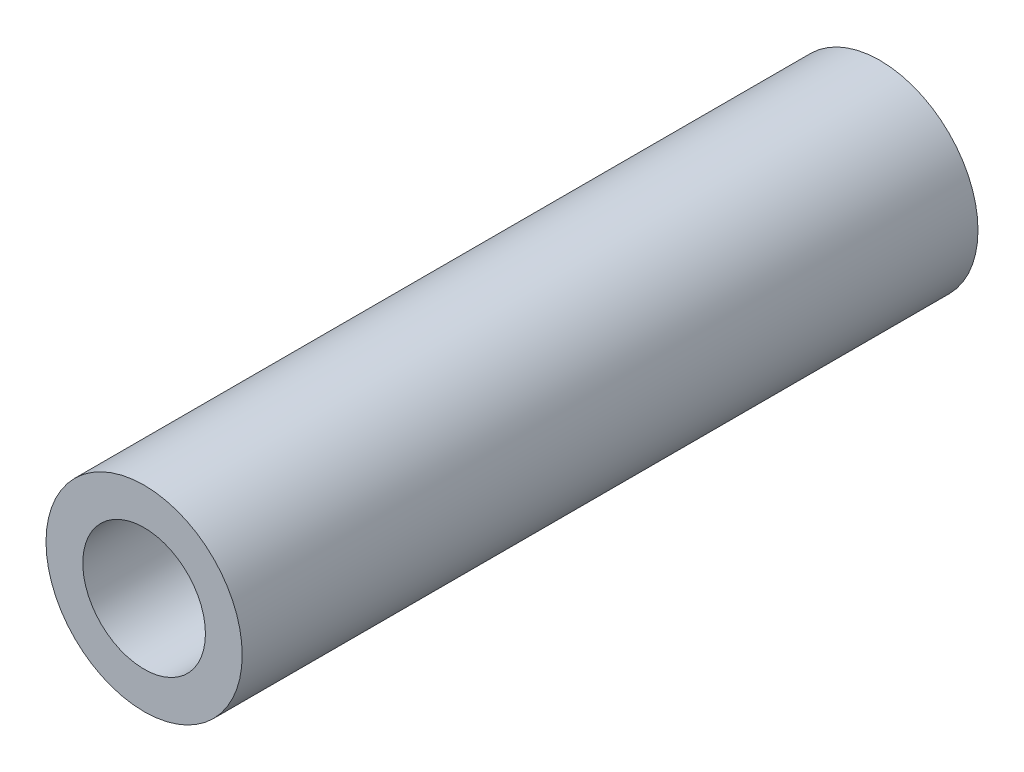
ISO-10303-21;
HEADER;
FILE_DESCRIPTION(('STEP AP214'),'2;1');
FILE_NAME('part.step','',(''),(''),'','','');
FILE_SCHEMA(('AUTOMOTIVE_DESIGN { 1 0 10303 214 1 1 1 1 }'));
ENDSEC;
DATA;
#1=APPLICATION_CONTEXT('core data for automotive mechanical design processes');
#2=APPLICATION_PROTOCOL_DEFINITION('international standard','automotive_design',2000,#1);
#3=PRODUCT_CONTEXT('',#1,'mechanical');
#4=PRODUCT('Part','Part','',(#3));
#5=PRODUCT_RELATED_PRODUCT_CATEGORY('part','',(#4));
#6=PRODUCT_DEFINITION_FORMATION('','',#4);
#7=PRODUCT_DEFINITION_CONTEXT('part definition',#1,'design');
#8=PRODUCT_DEFINITION('design','',#6,#7);
#9=PRODUCT_DEFINITION_SHAPE('','',#8);
#10=(LENGTH_UNIT() NAMED_UNIT(*) SI_UNIT(.MILLI.,.METRE.));
#11=(NAMED_UNIT(*) PLANE_ANGLE_UNIT() SI_UNIT($,.RADIAN.));
#12=(NAMED_UNIT(*) SI_UNIT($,.STERADIAN.) SOLID_ANGLE_UNIT());
#13=UNCERTAINTY_MEASURE_WITH_UNIT(LENGTH_MEASURE(1.E-05),#10,'distance_accuracy_value','');
#14=(GEOMETRIC_REPRESENTATION_CONTEXT(3) GLOBAL_UNCERTAINTY_ASSIGNED_CONTEXT((#13)) GLOBAL_UNIT_ASSIGNED_CONTEXT((#10,
#11,#12)) REPRESENTATION_CONTEXT('',''));
#15=CARTESIAN_POINT('',(0.,0.,0.));
#16=DIRECTION('',(0.,0.,1.));
#17=DIRECTION('',(1.,0.,0.));
#18=AXIS2_PLACEMENT_3D('',#15,#16,#17);
#19=CARTESIAN_POINT('',(0.,0.,15.));
#20=DIRECTION('',(0.,0.,1.));
#21=DIRECTION('',(1.,0.,0.));
#22=AXIS2_PLACEMENT_3D('',#19,#20,#21);
#23=PLANE('',#22);
#24=CARTESIAN_POINT('',(0.,0.,15.));
#25=DIRECTION('',(0.,0.,1.));
#26=DIRECTION('',(1.,0.,0.));
#27=AXIS2_PLACEMENT_3D('',#24,#25,#26);
#28=CIRCLE('',#27,4.);
#29=CARTESIAN_POINT('',(4.,0.,15.));
#30=VERTEX_POINT('',#29);
#31=EDGE_CURVE('E10',#30,#30,#28,.T.);
#32=ORIENTED_EDGE('',*,*,#31,.T.);
#33=EDGE_LOOP('',(#32));
#34=FACE_BOUND('',#33,.T.);
#35=CARTESIAN_POINT('',(0.,0.,15.));
#36=DIRECTION('',(0.,0.,1.));
#37=DIRECTION('',(1.,0.,0.));
#38=AXIS2_PLACEMENT_3D('',#35,#36,#37);
#39=CIRCLE('',#38,2.5);
#40=CARTESIAN_POINT('',(2.5,0.,15.));
#41=VERTEX_POINT('',#40);
#42=EDGE_CURVE('E42',#41,#41,#39,.T.);
#43=ORIENTED_EDGE('',*,*,#42,.F.);
#44=EDGE_LOOP('',(#43));
#45=FACE_BOUND('',#44,.T.);
#46=ADVANCED_FACE('F31',(#34,#45),#23,.T.);
#47=CARTESIAN_POINT('',(0.,0.,-15.));
#48=DIRECTION('',(0.,0.,1.));
#49=DIRECTION('',(1.,0.,0.));
#50=AXIS2_PLACEMENT_3D('',#47,#48,#49);
#51=PLANE('',#50);
#52=CARTESIAN_POINT('',(0.,0.,-15.));
#53=DIRECTION('',(0.,0.,1.));
#54=DIRECTION('',(1.,0.,0.));
#55=AXIS2_PLACEMENT_3D('',#52,#53,#54);
#56=CIRCLE('',#55,4.);
#57=CARTESIAN_POINT('',(4.,0.,-15.));
#58=VERTEX_POINT('',#57);
#59=EDGE_CURVE('E35',#58,#58,#56,.T.);
#60=ORIENTED_EDGE('',*,*,#59,.F.);
#61=EDGE_LOOP('',(#60));
#62=FACE_BOUND('',#61,.T.);
#63=CARTESIAN_POINT('',(0.,0.,-15.));
#64=DIRECTION('',(0.,0.,1.));
#65=DIRECTION('',(1.,0.,0.));
#66=AXIS2_PLACEMENT_3D('',#63,#64,#65);
#67=CIRCLE('',#66,2.5);
#68=CARTESIAN_POINT('',(2.5,0.,-15.));
#69=VERTEX_POINT('',#68);
#70=EDGE_CURVE('E44',#69,#69,#67,.T.);
#71=ORIENTED_EDGE('',*,*,#70,.T.);
#72=EDGE_LOOP('',(#71));
#73=FACE_BOUND('',#72,.T.);
#74=ADVANCED_FACE('F54',(#62,#73),#51,.F.);
#75=CARTESIAN_POINT('',(0.,0.,15.));
#76=DIRECTION('',(0.,0.,-1.));
#77=DIRECTION('',(-1.,0.,0.));
#78=AXIS2_PLACEMENT_3D('',#75,#76,#77);
#79=CYLINDRICAL_SURFACE('',#78,4.);
#80=ORIENTED_EDGE('',*,*,#31,.F.);
#81=EDGE_LOOP('',(#80));
#82=FACE_BOUND('',#81,.T.);
#83=ORIENTED_EDGE('',*,*,#59,.T.);
#84=EDGE_LOOP('',(#83));
#85=FACE_BOUND('',#84,.T.);
#86=ADVANCED_FACE('F33',(#82,#85),#79,.T.);
#87=CARTESIAN_POINT('',(0.,0.,15.));
#88=DIRECTION('',(0.,0.,-1.));
#89=DIRECTION('',(-1.,0.,0.));
#90=AXIS2_PLACEMENT_3D('',#87,#88,#89);
#91=CYLINDRICAL_SURFACE('',#90,2.5);
#92=ORIENTED_EDGE('',*,*,#42,.T.);
#93=EDGE_LOOP('',(#92));
#94=FACE_BOUND('',#93,.T.);
#95=ORIENTED_EDGE('',*,*,#70,.F.);
#96=EDGE_LOOP('',(#95));
#97=FACE_BOUND('',#96,.T.);
#98=ADVANCED_FACE('F50',(#94,#97),#91,.F.);
#99=CLOSED_SHELL('',(#46,#74,#86,#98));
#100=MANIFOLD_SOLID_BREP('B2',#99);
#101=ADVANCED_BREP_SHAPE_REPRESENTATION('',(#18,#100),#14);
#102=SHAPE_DEFINITION_REPRESENTATION(#9,#101);
ENDSEC;
END-ISO-10303-21;
